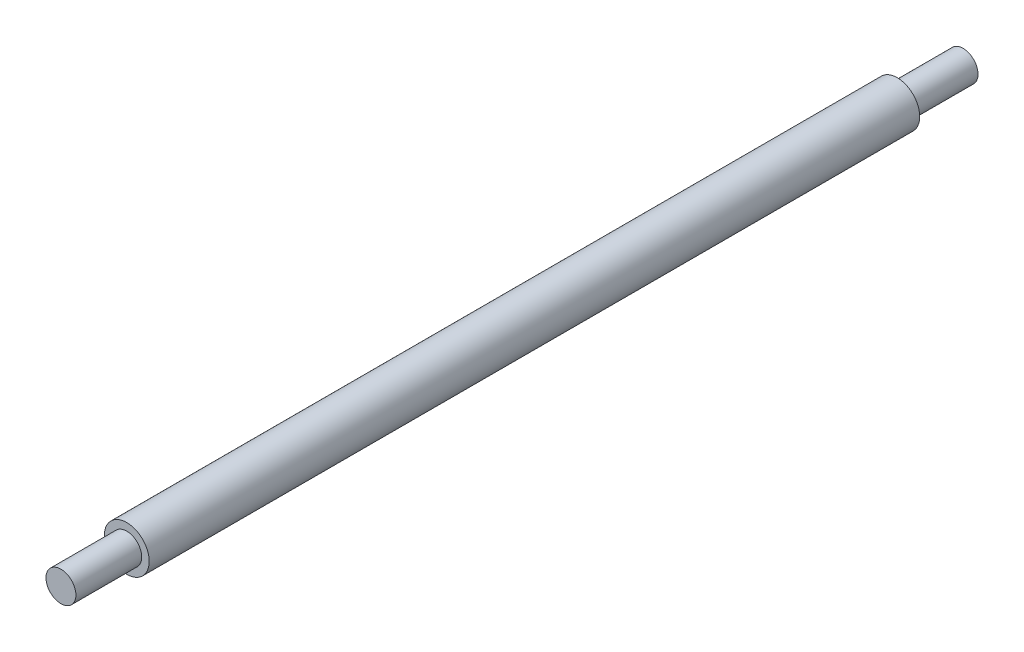
ISO-10303-21;
HEADER;
FILE_DESCRIPTION(('STEP AP214'),'2;1');
FILE_NAME('part.step','',(''),(''),'','','');
FILE_SCHEMA(('AUTOMOTIVE_DESIGN { 1 0 10303 214 1 1 1 1 }'));
ENDSEC;
DATA;
#1=APPLICATION_CONTEXT('core data for automotive mechanical design processes');
#2=APPLICATION_PROTOCOL_DEFINITION('international standard','automotive_design',2000,#1);
#3=PRODUCT_CONTEXT('',#1,'mechanical');
#4=PRODUCT('Part','Part','',(#3));
#5=PRODUCT_RELATED_PRODUCT_CATEGORY('part','',(#4));
#6=PRODUCT_DEFINITION_FORMATION('','',#4);
#7=PRODUCT_DEFINITION_CONTEXT('part definition',#1,'design');
#8=PRODUCT_DEFINITION('design','',#6,#7);
#9=PRODUCT_DEFINITION_SHAPE('','',#8);
#10=(LENGTH_UNIT() NAMED_UNIT(*) SI_UNIT(.MILLI.,.METRE.));
#11=(NAMED_UNIT(*) PLANE_ANGLE_UNIT() SI_UNIT($,.RADIAN.));
#12=(NAMED_UNIT(*) SI_UNIT($,.STERADIAN.) SOLID_ANGLE_UNIT());
#13=UNCERTAINTY_MEASURE_WITH_UNIT(LENGTH_MEASURE(1.E-05),#10,'distance_accuracy_value','');
#14=(GEOMETRIC_REPRESENTATION_CONTEXT(3) GLOBAL_UNCERTAINTY_ASSIGNED_CONTEXT((#13)) GLOBAL_UNIT_ASSIGNED_CONTEXT((#10,
#11,#12)) REPRESENTATION_CONTEXT('',''));
#15=CARTESIAN_POINT('',(0.,0.,0.));
#16=DIRECTION('',(0.,0.,1.));
#17=DIRECTION('',(1.,0.,0.));
#18=AXIS2_PLACEMENT_3D('',#15,#16,#17);
#19=CARTESIAN_POINT('',(0.,0.,327.025));
#20=DIRECTION('',(0.,0.,-1.));
#21=DIRECTION('',(-1.,0.,0.));
#22=AXIS2_PLACEMENT_3D('',#19,#20,#21);
#23=CYLINDRICAL_SURFACE('',#22,9.525);
#24=CARTESIAN_POINT('',(0.,0.,327.025));
#25=DIRECTION('',(0.,0.,1.));
#26=DIRECTION('',(1.,0.,0.));
#27=AXIS2_PLACEMENT_3D('',#24,#25,#26);
#28=CIRCLE('',#27,9.525);
#29=CARTESIAN_POINT('',(-9.525,0.,327.025));
#30=VERTEX_POINT('',#29);
#31=EDGE_CURVE('E43',#30,#30,#28,.T.);
#32=CARTESIAN_POINT('',(0.,0.,0.));
#33=DIRECTION('',(0.,0.,1.));
#34=DIRECTION('',(1.,0.,0.));
#35=AXIS2_PLACEMENT_3D('',#32,#33,#34);
#36=CIRCLE('',#35,9.525);
#37=CARTESIAN_POINT('',(-9.525,0.,0.));
#38=VERTEX_POINT('',#37);
#39=EDGE_CURVE('E34',#38,#38,#36,.T.);
#40=CARTESIAN_POINT('',(-9.525,0.,327.025));
#41=CARTESIAN_POINT('',(-9.525,0.,323.618489583333));
#42=CARTESIAN_POINT('',(-9.525,0.,320.211979166667));
#43=CARTESIAN_POINT('',(-9.525,0.,313.398958333333));
#44=CARTESIAN_POINT('',(-9.525,0.,309.992447916667));
#45=CARTESIAN_POINT('',(-9.525,0.,303.179427083333));
#46=CARTESIAN_POINT('',(-9.525,0.,299.772916666667));
#47=CARTESIAN_POINT('',(-9.525,0.,292.959895833333));
#48=CARTESIAN_POINT('',(-9.525,0.,289.553385416667));
#49=CARTESIAN_POINT('',(-9.525,0.,282.740364583333));
#50=CARTESIAN_POINT('',(-9.525,0.,279.333854166667));
#51=CARTESIAN_POINT('',(-9.525,0.,272.520833333333));
#52=CARTESIAN_POINT('',(-9.525,0.,269.114322916667));
#53=CARTESIAN_POINT('',(-9.525,0.,262.301302083333));
#54=CARTESIAN_POINT('',(-9.525,0.,258.894791666667));
#55=CARTESIAN_POINT('',(-9.525,0.,252.081770833333));
#56=CARTESIAN_POINT('',(-9.525,0.,248.675260416667));
#57=CARTESIAN_POINT('',(-9.525,0.,241.862239583333));
#58=CARTESIAN_POINT('',(-9.525,0.,238.455729166667));
#59=CARTESIAN_POINT('',(-9.525,0.,231.642708333333));
#60=CARTESIAN_POINT('',(-9.525,0.,228.236197916667));
#61=CARTESIAN_POINT('',(-9.525,0.,221.423177083333));
#62=CARTESIAN_POINT('',(-9.525,0.,218.016666666667));
#63=CARTESIAN_POINT('',(-9.525,0.,211.203645833333));
#64=CARTESIAN_POINT('',(-9.525,0.,207.797135416667));
#65=CARTESIAN_POINT('',(-9.525,0.,200.984114583333));
#66=CARTESIAN_POINT('',(-9.525,0.,197.577604166667));
#67=CARTESIAN_POINT('',(-9.525,0.,190.764583333333));
#68=CARTESIAN_POINT('',(-9.525,0.,187.358072916667));
#69=CARTESIAN_POINT('',(-9.525,0.,180.545052083333));
#70=CARTESIAN_POINT('',(-9.525,0.,177.138541666667));
#71=CARTESIAN_POINT('',(-9.525,0.,170.325520833333));
#72=CARTESIAN_POINT('',(-9.525,0.,166.919010416667));
#73=CARTESIAN_POINT('',(-9.525,0.,160.105989583333));
#74=CARTESIAN_POINT('',(-9.525,0.,156.699479166667));
#75=CARTESIAN_POINT('',(-9.525,0.,149.886458333333));
#76=CARTESIAN_POINT('',(-9.525,0.,146.479947916667));
#77=CARTESIAN_POINT('',(-9.525,0.,139.666927083333));
#78=CARTESIAN_POINT('',(-9.525,0.,136.260416666667));
#79=CARTESIAN_POINT('',(-9.525,0.,129.447395833333));
#80=CARTESIAN_POINT('',(-9.525,0.,126.040885416667));
#81=CARTESIAN_POINT('',(-9.525,0.,119.227864583333));
#82=CARTESIAN_POINT('',(-9.525,0.,115.821354166667));
#83=CARTESIAN_POINT('',(-9.525,0.,109.008333333333));
#84=CARTESIAN_POINT('',(-9.525,0.,105.601822916667));
#85=CARTESIAN_POINT('',(-9.525,0.,98.7888020833333));
#86=CARTESIAN_POINT('',(-9.525,0.,95.3822916666666));
#87=CARTESIAN_POINT('',(-9.525,0.,88.5692708333332));
#88=CARTESIAN_POINT('',(-9.525,0.,85.1627604166666));
#89=CARTESIAN_POINT('',(-9.525,0.,78.3497395833333));
#90=CARTESIAN_POINT('',(-9.525,0.,74.9432291666666));
#91=CARTESIAN_POINT('',(-9.525,0.,68.1302083333333));
#92=CARTESIAN_POINT('',(-9.525,0.,64.7236979166666));
#93=CARTESIAN_POINT('',(-9.525,0.,57.9106770833333));
#94=CARTESIAN_POINT('',(-9.525,0.,54.5041666666666));
#95=CARTESIAN_POINT('',(-9.525,0.,47.6911458333333));
#96=CARTESIAN_POINT('',(-9.525,0.,44.2846354166666));
#97=CARTESIAN_POINT('',(-9.525,0.,37.4716145833333));
#98=CARTESIAN_POINT('',(-9.525,0.,34.0651041666666));
#99=CARTESIAN_POINT('',(-9.525,0.,27.2520833333333));
#100=CARTESIAN_POINT('',(-9.525,0.,23.8455729166666));
#101=CARTESIAN_POINT('',(-9.525,0.,17.0325520833333));
#102=CARTESIAN_POINT('',(-9.525,0.,13.6260416666666));
#103=CARTESIAN_POINT('',(-9.525,0.,6.8130208333333));
#104=CARTESIAN_POINT('',(-9.525,0.,3.40651041666663));
#105=CARTESIAN_POINT('',(-9.525,0.,0.));
#106=B_SPLINE_CURVE_WITH_KNOTS('',3,(#40,#41,#42,#43,#44,#45,#46,#47,#48,#49,#50,#51,#52,#53,
#54,#55,#56,#57,#58,#59,#60,#61,#62,#63,#64,#65,#66,#67,#68,#69,#70,#71,#72,#73,#74,#75,#76,#77,
#78,#79,#80,#81,#82,#83,#84,#85,#86,#87,#88,#89,#90,#91,#92,#93,#94,#95,#96,#97,#98,#99,#100,
#101,#102,#103,#104,#105),.UNSPECIFIED.,.F.,.F.,(4,2,2,2,2,2,2,2,2,2,2,2,2,2,2,2,2,2,2,2,2,2,2,
2,2,2,2,2,2,2,2,2,4),(0.,10.21953125,20.4390625,30.65859375,40.878125,51.0976562500001,
61.3171875,71.5367187500001,81.75625,91.9757812500001,102.1953125,112.41484375,122.634375,
132.85390625,143.0734375,153.29296875,163.5125,173.73203125,183.9515625,194.17109375,204.390625,
214.61015625,224.8296875,235.04921875,245.26875,255.48828125,265.7078125,275.92734375,
286.146875,296.36640625,306.5859375,316.80546875,327.025),.UNSPECIFIED.);
#107=EDGE_CURVE('BSEAM31',#30,#38,#106,.T.);
#108=ORIENTED_EDGE('',*,*,#31,.F.);
#109=ORIENTED_EDGE('',*,*,#39,.T.);
#110=ORIENTED_EDGE('',*,*,#107,.T.);
#111=ORIENTED_EDGE('',*,*,#107,.F.);
#112=EDGE_LOOP('',(#108,#110,#109,#111));
#113=FACE_BOUND('',#112,.T.);
#114=ADVANCED_FACE('F31',(#113),#23,.T.);
#115=CARTESIAN_POINT('',(0.,0.,327.025));
#116=DIRECTION('',(0.,0.,1.));
#117=DIRECTION('',(1.,0.,0.));
#118=AXIS2_PLACEMENT_3D('',#115,#116,#117);
#119=PLANE('',#118);
#120=CARTESIAN_POINT('',(0.,0.,327.025));
#121=DIRECTION('',(0.,0.,1.));
#122=DIRECTION('',(1.,0.,0.));
#123=AXIS2_PLACEMENT_3D('',#120,#121,#122);
#124=CIRCLE('',#123,6.35);
#125=CARTESIAN_POINT('',(6.35,0.,327.025));
#126=VERTEX_POINT('',#125);
#127=EDGE_CURVE('E38',#126,#126,#124,.T.);
#128=ORIENTED_EDGE('',*,*,#127,.F.);
#129=EDGE_LOOP('',(#128));
#130=FACE_BOUND('',#129,.T.);
#131=ORIENTED_EDGE('',*,*,#31,.T.);
#132=EDGE_LOOP('',(#131));
#133=FACE_BOUND('',#132,.T.);
#134=ADVANCED_FACE('F60',(#130,#133),#119,.T.);
#135=CARTESIAN_POINT('',(0.,0.,0.));
#136=DIRECTION('',(0.,0.,1.));
#137=DIRECTION('',(1.,0.,0.));
#138=AXIS2_PLACEMENT_3D('',#135,#136,#137);
#139=PLANE('',#138);
#140=CARTESIAN_POINT('',(0.,0.,0.));
#141=DIRECTION('',(0.,0.,-1.));
#142=DIRECTION('',(-1.,0.,0.));
#143=AXIS2_PLACEMENT_3D('',#140,#141,#142);
#144=CIRCLE('',#143,6.35);
#145=CARTESIAN_POINT('',(-6.35,0.,0.));
#146=VERTEX_POINT('',#145);
#147=EDGE_CURVE('E10',#146,#146,#144,.T.);
#148=ORIENTED_EDGE('',*,*,#147,.F.);
#149=EDGE_LOOP('',(#148));
#150=FACE_BOUND('',#149,.T.);
#151=ORIENTED_EDGE('',*,*,#39,.F.);
#152=EDGE_LOOP('',(#151));
#153=FACE_BOUND('',#152,.T.);
#154=ADVANCED_FACE('F57',(#150,#153),#139,.F.);
#155=CARTESIAN_POINT('',(0.,0.,354.965));
#156=DIRECTION('',(0.,0.,-1.));
#157=DIRECTION('',(-1.,0.,0.));
#158=AXIS2_PLACEMENT_3D('',#155,#156,#157);
#159=CYLINDRICAL_SURFACE('',#158,6.35);
#160=CARTESIAN_POINT('',(0.,0.,354.965));
#161=DIRECTION('',(0.,0.,1.));
#162=DIRECTION('',(1.,0.,0.));
#163=AXIS2_PLACEMENT_3D('',#160,#161,#162);
#164=CIRCLE('',#163,6.35);
#165=CARTESIAN_POINT('',(6.35,0.,354.965));
#166=VERTEX_POINT('',#165);
#167=EDGE_CURVE('E48',#166,#166,#164,.T.);
#168=ORIENTED_EDGE('',*,*,#167,.F.);
#169=EDGE_LOOP('',(#168));
#170=FACE_BOUND('',#169,.T.);
#171=ORIENTED_EDGE('',*,*,#127,.T.);
#172=EDGE_LOOP('',(#171));
#173=FACE_BOUND('',#172,.T.);
#174=ADVANCED_FACE('F59',(#170,#173),#159,.T.);
#175=CARTESIAN_POINT('',(0.,0.,354.965));
#176=DIRECTION('',(0.,0.,1.));
#177=DIRECTION('',(1.,0.,0.));
#178=AXIS2_PLACEMENT_3D('',#175,#176,#177);
#179=PLANE('',#178);
#180=ORIENTED_EDGE('',*,*,#167,.T.);
#181=EDGE_LOOP('',(#180));
#182=FACE_BOUND('',#181,.T.);
#183=ADVANCED_FACE('F66',(#182),#179,.T.);
#184=CARTESIAN_POINT('',(0.,0.,-27.94));
#185=DIRECTION('',(0.,0.,1.));
#186=DIRECTION('',(1.,0.,0.));
#187=AXIS2_PLACEMENT_3D('',#184,#185,#186);
#188=CYLINDRICAL_SURFACE('',#187,6.35);
#189=CARTESIAN_POINT('',(0.,0.,-27.94));
#190=DIRECTION('',(0.,0.,-1.));
#191=DIRECTION('',(-1.,0.,0.));
#192=AXIS2_PLACEMENT_3D('',#189,#190,#191);
#193=CIRCLE('',#192,6.35);
#194=CARTESIAN_POINT('',(-6.35,0.,-27.94));
#195=VERTEX_POINT('',#194);
#196=EDGE_CURVE('E47',#195,#195,#193,.T.);
#197=ORIENTED_EDGE('',*,*,#196,.F.);
#198=EDGE_LOOP('',(#197));
#199=FACE_BOUND('',#198,.T.);
#200=ORIENTED_EDGE('',*,*,#147,.T.);
#201=EDGE_LOOP('',(#200));
#202=FACE_BOUND('',#201,.T.);
#203=ADVANCED_FACE('F94',(#199,#202),#188,.T.);
#204=CARTESIAN_POINT('',(0.,0.,-27.94));
#205=DIRECTION('',(0.,0.,-1.));
#206=DIRECTION('',(-1.,0.,0.));
#207=AXIS2_PLACEMENT_3D('',#204,#205,#206);
#208=PLANE('',#207);
#209=ORIENTED_EDGE('',*,*,#196,.T.);
#210=EDGE_LOOP('',(#209));
#211=FACE_BOUND('',#210,.T.);
#212=ADVANCED_FACE('F108',(#211),#208,.T.);
#213=CLOSED_SHELL('',(#114,#134,#154,#174,#183,#203,#212));
#214=MANIFOLD_SOLID_BREP('B2',#213);
#215=ADVANCED_BREP_SHAPE_REPRESENTATION('',(#18,#214),#14);
#216=SHAPE_DEFINITION_REPRESENTATION(#9,#215);
ENDSEC;
END-ISO-10303-21;
